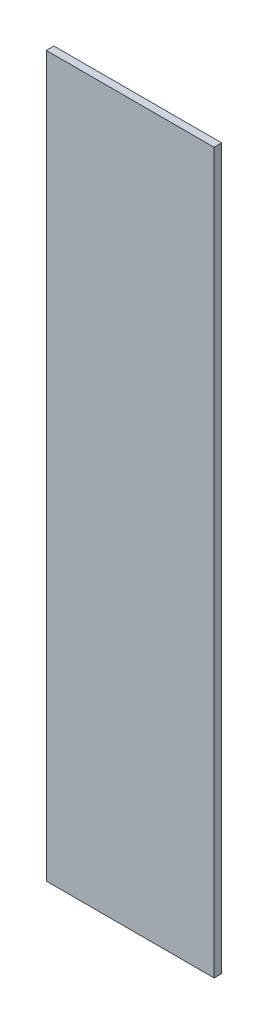
ISO-10303-21;
HEADER;
FILE_DESCRIPTION(('STEP AP214'),'2;1');
FILE_NAME('part.step','',(''),(''),'','','');
FILE_SCHEMA(('AUTOMOTIVE_DESIGN { 1 0 10303 214 1 1 1 1 }'));
ENDSEC;
DATA;
#1=APPLICATION_CONTEXT('core data for automotive mechanical design processes');
#2=APPLICATION_PROTOCOL_DEFINITION('international standard','automotive_design',2000,#1);
#3=PRODUCT_CONTEXT('',#1,'mechanical');
#4=PRODUCT('Part','Part','',(#3));
#5=PRODUCT_RELATED_PRODUCT_CATEGORY('part','',(#4));
#6=PRODUCT_DEFINITION_FORMATION('','',#4);
#7=PRODUCT_DEFINITION_CONTEXT('part definition',#1,'design');
#8=PRODUCT_DEFINITION('design','',#6,#7);
#9=PRODUCT_DEFINITION_SHAPE('','',#8);
#10=(LENGTH_UNIT() NAMED_UNIT(*) SI_UNIT(.MILLI.,.METRE.));
#11=(NAMED_UNIT(*) PLANE_ANGLE_UNIT() SI_UNIT($,.RADIAN.));
#12=(NAMED_UNIT(*) SI_UNIT($,.STERADIAN.) SOLID_ANGLE_UNIT());
#13=UNCERTAINTY_MEASURE_WITH_UNIT(LENGTH_MEASURE(1.E-05),#10,'distance_accuracy_value','');
#14=(GEOMETRIC_REPRESENTATION_CONTEXT(3) GLOBAL_UNCERTAINTY_ASSIGNED_CONTEXT((#13)) GLOBAL_UNIT_ASSIGNED_CONTEXT((#10,
#11,#12)) REPRESENTATION_CONTEXT('',''));
#15=CARTESIAN_POINT('',(0.,0.,0.));
#16=DIRECTION('',(0.,0.,1.));
#17=DIRECTION('',(1.,0.,0.));
#18=AXIS2_PLACEMENT_3D('',#15,#16,#17);
#19=CARTESIAN_POINT('',(1390.49314049718,1332.04489692115,-12.7));
#20=DIRECTION('',(1.,0.,0.));
#21=DIRECTION('',(0.,1.,0.));
#22=AXIS2_PLACEMENT_3D('',#19,#20,#21);
#23=PLANE('',#22);
#24=DIRECTION('',(0.,0.,1.));
#25=VECTOR('',#24,1.);
#26=CARTESIAN_POINT('',(1390.49314049718,1332.04489692115,-12.7));
#27=LINE('',#26,#25);
#28=CARTESIAN_POINT('',(1390.49314049718,1332.04489692115,-12.7));
#29=VERTEX_POINT('',#28);
#30=CARTESIAN_POINT('',(1390.49314049718,1332.04489692115,12.7));
#31=VERTEX_POINT('',#30);
#32=EDGE_CURVE('E42',#29,#31,#27,.T.);
#33=ORIENTED_EDGE('',*,*,#32,.T.);
#34=DIRECTION('',(0.,1.,0.));
#35=VECTOR('',#34,1.);
#36=CARTESIAN_POINT('',(1390.49314049718,1332.04489692115,12.7));
#37=LINE('',#36,#35);
#38=CARTESIAN_POINT('',(1390.49314049718,-1067.95510307885,12.7));
#39=VERTEX_POINT('',#38);
#40=EDGE_CURVE('E79',#39,#31,#37,.T.);
#41=ORIENTED_EDGE('',*,*,#40,.F.);
#42=DIRECTION('',(0.,0.,1.));
#43=VECTOR('',#42,1.);
#44=CARTESIAN_POINT('',(1390.49314049718,-1067.95510307885,-12.7));
#45=LINE('',#44,#43);
#46=CARTESIAN_POINT('',(1390.49314049718,-1067.95510307885,-12.7));
#47=VERTEX_POINT('',#46);
#48=EDGE_CURVE('E11',#47,#39,#45,.T.);
#49=ORIENTED_EDGE('',*,*,#48,.F.);
#50=DIRECTION('',(0.,1.,0.));
#51=VECTOR('',#50,1.);
#52=CARTESIAN_POINT('',(1390.49314049718,1332.04489692115,-12.7));
#53=LINE('',#52,#51);
#54=EDGE_CURVE('E80',#47,#29,#53,.T.);
#55=ORIENTED_EDGE('',*,*,#54,.T.);
#56=EDGE_LOOP('',(#33,#41,#49,#55));
#57=FACE_BOUND('',#56,.T.);
#58=ADVANCED_FACE('F39',(#57),#23,.T.);
#59=CARTESIAN_POINT('',(830.493140497184,-1067.95510307885,-12.7));
#60=DIRECTION('',(0.,-1.,0.));
#61=DIRECTION('',(0.,0.,-1.));
#62=AXIS2_PLACEMENT_3D('',#59,#60,#61);
#63=PLANE('',#62);
#64=ORIENTED_EDGE('',*,*,#48,.T.);
#65=DIRECTION('',(1.,0.,0.));
#66=VECTOR('',#65,1.);
#67=CARTESIAN_POINT('',(830.493140497184,-1067.95510307885,12.7));
#68=LINE('',#67,#66);
#69=CARTESIAN_POINT('',(830.493140497184,-1067.95510307885,12.7));
#70=VERTEX_POINT('',#69);
#71=EDGE_CURVE('E96',#70,#39,#68,.T.);
#72=ORIENTED_EDGE('',*,*,#71,.F.);
#73=DIRECTION('',(0.,0.,1.));
#74=VECTOR('',#73,1.);
#75=CARTESIAN_POINT('',(830.493140497184,-1067.95510307885,-12.7));
#76=LINE('',#75,#74);
#77=CARTESIAN_POINT('',(830.493140497184,-1067.95510307885,-12.7));
#78=VERTEX_POINT('',#77);
#79=EDGE_CURVE('E47',#78,#70,#76,.T.);
#80=ORIENTED_EDGE('',*,*,#79,.F.);
#81=DIRECTION('',(1.,0.,0.));
#82=VECTOR('',#81,1.);
#83=CARTESIAN_POINT('',(830.493140497184,-1067.95510307885,-12.7));
#84=LINE('',#83,#82);
#85=EDGE_CURVE('E85',#78,#47,#84,.T.);
#86=ORIENTED_EDGE('',*,*,#85,.T.);
#87=EDGE_LOOP('',(#64,#72,#80,#86));
#88=FACE_BOUND('',#87,.T.);
#89=ADVANCED_FACE('F111',(#88),#63,.T.);
#90=CARTESIAN_POINT('',(830.493140497184,1332.04489692115,-12.7));
#91=DIRECTION('',(-1.,0.,0.));
#92=DIRECTION('',(0.,-1.,0.));
#93=AXIS2_PLACEMENT_3D('',#90,#91,#92);
#94=PLANE('',#93);
#95=ORIENTED_EDGE('',*,*,#79,.T.);
#96=DIRECTION('',(0.,-1.,0.));
#97=VECTOR('',#96,1.);
#98=CARTESIAN_POINT('',(830.493140497184,1332.04489692115,12.7));
#99=LINE('',#98,#97);
#100=CARTESIAN_POINT('',(830.493140497184,1332.04489692115,12.7));
#101=VERTEX_POINT('',#100);
#102=EDGE_CURVE('E92',#101,#70,#99,.T.);
#103=ORIENTED_EDGE('',*,*,#102,.F.);
#104=DIRECTION('',(0.,0.,1.));
#105=VECTOR('',#104,1.);
#106=CARTESIAN_POINT('',(830.493140497184,1332.04489692115,-12.7));
#107=LINE('',#106,#105);
#108=CARTESIAN_POINT('',(830.493140497184,1332.04489692115,-12.7));
#109=VERTEX_POINT('',#108);
#110=EDGE_CURVE('E84',#109,#101,#107,.T.);
#111=ORIENTED_EDGE('',*,*,#110,.F.);
#112=DIRECTION('',(0.,-1.,0.));
#113=VECTOR('',#112,1.);
#114=CARTESIAN_POINT('',(830.493140497184,1332.04489692115,-12.7));
#115=LINE('',#114,#113);
#116=EDGE_CURVE('E104',#109,#78,#115,.T.);
#117=ORIENTED_EDGE('',*,*,#116,.T.);
#118=EDGE_LOOP('',(#95,#103,#111,#117));
#119=FACE_BOUND('',#118,.T.);
#120=ADVANCED_FACE('F108',(#119),#94,.T.);
#121=CARTESIAN_POINT('',(830.493140497184,1332.04489692115,-12.7));
#122=DIRECTION('',(0.,1.,0.));
#123=DIRECTION('',(0.,0.,1.));
#124=AXIS2_PLACEMENT_3D('',#121,#122,#123);
#125=PLANE('',#124);
#126=ORIENTED_EDGE('',*,*,#110,.T.);
#127=DIRECTION('',(-1.,0.,0.));
#128=VECTOR('',#127,1.);
#129=CARTESIAN_POINT('',(830.493140497184,1332.04489692115,12.7));
#130=LINE('',#129,#128);
#131=EDGE_CURVE('E87',#31,#101,#130,.T.);
#132=ORIENTED_EDGE('',*,*,#131,.F.);
#133=ORIENTED_EDGE('',*,*,#32,.F.);
#134=DIRECTION('',(-1.,0.,0.));
#135=VECTOR('',#134,1.);
#136=CARTESIAN_POINT('',(830.493140497184,1332.04489692115,-12.7));
#137=LINE('',#136,#135);
#138=EDGE_CURVE('E102',#29,#109,#137,.T.);
#139=ORIENTED_EDGE('',*,*,#138,.T.);
#140=EDGE_LOOP('',(#126,#132,#133,#139));
#141=FACE_BOUND('',#140,.T.);
#142=ADVANCED_FACE('F88',(#141),#125,.T.);
#143=CARTESIAN_POINT('',(0.,0.,-12.7));
#144=DIRECTION('',(0.,0.,1.));
#145=DIRECTION('',(1.,0.,0.));
#146=AXIS2_PLACEMENT_3D('',#143,#144,#145);
#147=PLANE('',#146);
#148=ORIENTED_EDGE('',*,*,#54,.F.);
#149=ORIENTED_EDGE('',*,*,#85,.F.);
#150=ORIENTED_EDGE('',*,*,#116,.F.);
#151=ORIENTED_EDGE('',*,*,#138,.F.);
#152=EDGE_LOOP('',(#148,#149,#150,#151));
#153=FACE_BOUND('',#152,.T.);
#154=ADVANCED_FACE('F113',(#153),#147,.F.);
#155=CARTESIAN_POINT('',(0.,0.,12.7));
#156=DIRECTION('',(0.,0.,1.));
#157=DIRECTION('',(1.,0.,0.));
#158=AXIS2_PLACEMENT_3D('',#155,#156,#157);
#159=PLANE('',#158);
#160=ORIENTED_EDGE('',*,*,#40,.T.);
#161=ORIENTED_EDGE('',*,*,#131,.T.);
#162=ORIENTED_EDGE('',*,*,#102,.T.);
#163=ORIENTED_EDGE('',*,*,#71,.T.);
#164=EDGE_LOOP('',(#160,#161,#162,#163));
#165=FACE_BOUND('',#164,.T.);
#166=ADVANCED_FACE('F95',(#165),#159,.T.);
#167=CLOSED_SHELL('',(#58,#89,#120,#142,#154,#166));
#168=MANIFOLD_SOLID_BREP('B2',#167);
#169=ADVANCED_BREP_SHAPE_REPRESENTATION('',(#18,#168),#14);
#170=SHAPE_DEFINITION_REPRESENTATION(#9,#169);
ENDSEC;
END-ISO-10303-21;
